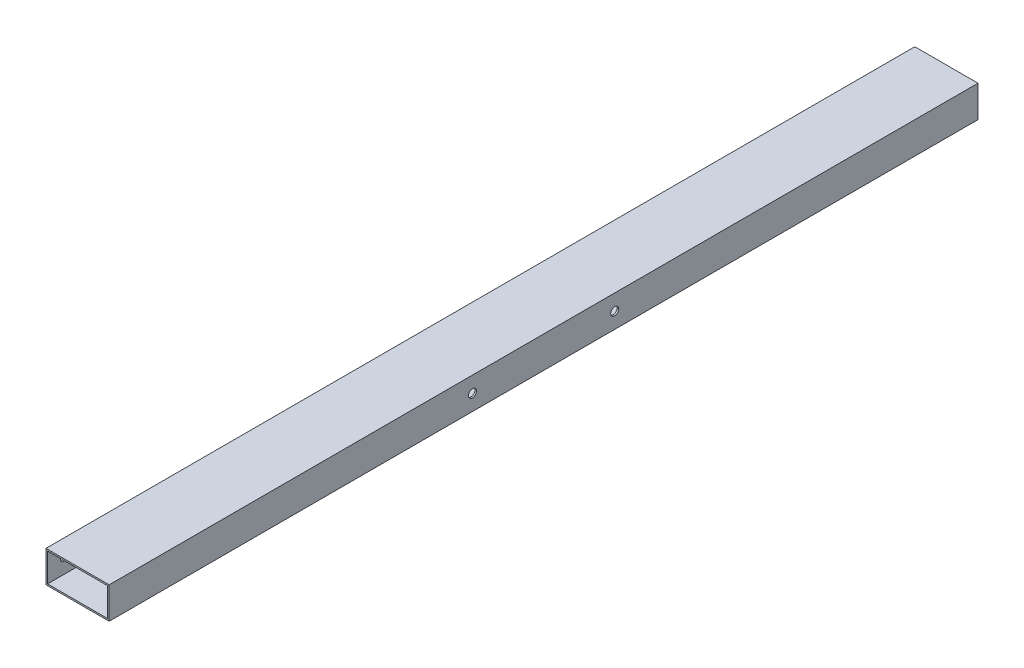
ISO-10303-21;
HEADER;
FILE_DESCRIPTION(('STEP AP214'),'2;1');
FILE_NAME('part.step','',(''),(''),'','','');
FILE_SCHEMA(('AUTOMOTIVE_DESIGN { 1 0 10303 214 1 1 1 1 }'));
ENDSEC;
DATA;
#1=APPLICATION_CONTEXT('core data for automotive mechanical design processes');
#2=APPLICATION_PROTOCOL_DEFINITION('international standard','automotive_design',2000,#1);
#3=PRODUCT_CONTEXT('',#1,'mechanical');
#4=PRODUCT('Part','Part','',(#3));
#5=PRODUCT_RELATED_PRODUCT_CATEGORY('part','',(#4));
#6=PRODUCT_DEFINITION_FORMATION('','',#4);
#7=PRODUCT_DEFINITION_CONTEXT('part definition',#1,'design');
#8=PRODUCT_DEFINITION('design','',#6,#7);
#9=PRODUCT_DEFINITION_SHAPE('','',#8);
#10=(LENGTH_UNIT() NAMED_UNIT(*) SI_UNIT(.MILLI.,.METRE.));
#11=(NAMED_UNIT(*) PLANE_ANGLE_UNIT() SI_UNIT($,.RADIAN.));
#12=(NAMED_UNIT(*) SI_UNIT($,.STERADIAN.) SOLID_ANGLE_UNIT());
#13=UNCERTAINTY_MEASURE_WITH_UNIT(LENGTH_MEASURE(1.E-05),#10,'distance_accuracy_value','');
#14=(GEOMETRIC_REPRESENTATION_CONTEXT(3) GLOBAL_UNCERTAINTY_ASSIGNED_CONTEXT((#13)) GLOBAL_UNIT_ASSIGNED_CONTEXT((#10,
#11,#12)) REPRESENTATION_CONTEXT('',''));
#15=CARTESIAN_POINT('',(0.,0.,0.));
#16=DIRECTION('',(0.,0.,1.));
#17=DIRECTION('',(1.,0.,0.));
#18=AXIS2_PLACEMENT_3D('',#15,#16,#17);
#19=CARTESIAN_POINT('',(0.,0.,550.));
#20=DIRECTION('',(0.,0.,1.));
#21=DIRECTION('',(1.,0.,0.));
#22=AXIS2_PLACEMENT_3D('',#19,#20,#21);
#23=PLANE('',#22);
#24=DIRECTION('',(0.,-1.,0.));
#25=VECTOR('',#24,1.);
#26=CARTESIAN_POINT('',(0.,0.,550.));
#27=LINE('',#26,#25);
#28=CARTESIAN_POINT('',(0.,0.,550.));
#29=VERTEX_POINT('',#28);
#30=CARTESIAN_POINT('',(0.,-20.,550.));
#31=VERTEX_POINT('',#30);
#32=EDGE_CURVE('E170',#29,#31,#27,.T.);
#33=ORIENTED_EDGE('',*,*,#32,.T.);
#34=DIRECTION('',(1.,0.,0.));
#35=VECTOR('',#34,1.);
#36=CARTESIAN_POINT('',(0.,-20.,550.));
#37=LINE('',#36,#35);
#38=CARTESIAN_POINT('',(40.,-20.,550.));
#39=VERTEX_POINT('',#38);
#40=EDGE_CURVE('E173',#31,#39,#37,.T.);
#41=ORIENTED_EDGE('',*,*,#40,.T.);
#42=DIRECTION('',(0.,1.,0.));
#43=VECTOR('',#42,1.);
#44=CARTESIAN_POINT('',(40.,0.,550.));
#45=LINE('',#44,#43);
#46=CARTESIAN_POINT('',(40.,0.,550.));
#47=VERTEX_POINT('',#46);
#48=EDGE_CURVE('E176',#39,#47,#45,.T.);
#49=ORIENTED_EDGE('',*,*,#48,.T.);
#50=DIRECTION('',(-1.,0.,0.));
#51=VECTOR('',#50,1.);
#52=CARTESIAN_POINT('',(0.,0.,550.));
#53=LINE('',#52,#51);
#54=EDGE_CURVE('E178',#47,#29,#53,.T.);
#55=ORIENTED_EDGE('',*,*,#54,.T.);
#56=EDGE_LOOP('',(#33,#41,#49,#55));
#57=FACE_BOUND('',#56,.T.);
#58=DIRECTION('',(1.,0.,0.));
#59=VECTOR('',#58,1.);
#60=CARTESIAN_POINT('',(0.,-19.,550.));
#61=LINE('',#60,#59);
#62=CARTESIAN_POINT('',(1.,-19.,550.));
#63=VERTEX_POINT('',#62);
#64=CARTESIAN_POINT('',(39.,-19.,550.));
#65=VERTEX_POINT('',#64);
#66=EDGE_CURVE('E140',#63,#65,#61,.T.);
#67=ORIENTED_EDGE('',*,*,#66,.F.);
#68=DIRECTION('',(0.,-1.,0.));
#69=VECTOR('',#68,1.);
#70=CARTESIAN_POINT('',(1.,0.,550.));
#71=LINE('',#70,#69);
#72=CARTESIAN_POINT('',(1.,-1.,550.));
#73=VERTEX_POINT('',#72);
#74=EDGE_CURVE('E132',#73,#63,#71,.T.);
#75=ORIENTED_EDGE('',*,*,#74,.F.);
#76=DIRECTION('',(-1.,0.,0.));
#77=VECTOR('',#76,1.);
#78=CARTESIAN_POINT('',(0.,-1.,550.));
#79=LINE('',#78,#77);
#80=CARTESIAN_POINT('',(39.,-1.,550.));
#81=VERTEX_POINT('',#80);
#82=EDGE_CURVE('E154',#81,#73,#79,.T.);
#83=ORIENTED_EDGE('',*,*,#82,.F.);
#84=DIRECTION('',(0.,1.,0.));
#85=VECTOR('',#84,1.);
#86=CARTESIAN_POINT('',(39.,0.,550.));
#87=LINE('',#86,#85);
#88=EDGE_CURVE('E152',#65,#81,#87,.T.);
#89=ORIENTED_EDGE('',*,*,#88,.F.);
#90=EDGE_LOOP('',(#67,#75,#83,#89));
#91=FACE_BOUND('',#90,.T.);
#92=ADVANCED_FACE('F65',(#57,#91),#23,.T.);
#93=CARTESIAN_POINT('',(0.,0.,0.));
#94=DIRECTION('',(0.,0.,1.));
#95=DIRECTION('',(1.,0.,0.));
#96=AXIS2_PLACEMENT_3D('',#93,#94,#95);
#97=PLANE('',#96);
#98=DIRECTION('',(0.,-1.,0.));
#99=VECTOR('',#98,1.);
#100=CARTESIAN_POINT('',(0.,0.,0.));
#101=LINE('',#100,#99);
#102=CARTESIAN_POINT('',(0.,0.,0.));
#103=VERTEX_POINT('',#102);
#104=CARTESIAN_POINT('',(0.,-20.,0.));
#105=VERTEX_POINT('',#104);
#106=EDGE_CURVE('E148',#103,#105,#101,.T.);
#107=ORIENTED_EDGE('',*,*,#106,.F.);
#108=DIRECTION('',(-1.,0.,0.));
#109=VECTOR('',#108,1.);
#110=CARTESIAN_POINT('',(0.,0.,0.));
#111=LINE('',#110,#109);
#112=CARTESIAN_POINT('',(40.,0.,0.));
#113=VERTEX_POINT('',#112);
#114=EDGE_CURVE('E174',#113,#103,#111,.T.);
#115=ORIENTED_EDGE('',*,*,#114,.F.);
#116=DIRECTION('',(0.,1.,0.));
#117=VECTOR('',#116,1.);
#118=CARTESIAN_POINT('',(40.,0.,0.));
#119=LINE('',#118,#117);
#120=CARTESIAN_POINT('',(40.,-20.,0.));
#121=VERTEX_POINT('',#120);
#122=EDGE_CURVE('E185',#121,#113,#119,.T.);
#123=ORIENTED_EDGE('',*,*,#122,.F.);
#124=DIRECTION('',(1.,0.,0.));
#125=VECTOR('',#124,1.);
#126=CARTESIAN_POINT('',(0.,-20.,0.));
#127=LINE('',#126,#125);
#128=EDGE_CURVE('E183',#105,#121,#127,.T.);
#129=ORIENTED_EDGE('',*,*,#128,.F.);
#130=EDGE_LOOP('',(#107,#115,#123,#129));
#131=FACE_BOUND('',#130,.T.);
#132=DIRECTION('',(0.,-1.,0.));
#133=VECTOR('',#132,1.);
#134=CARTESIAN_POINT('',(1.,0.,0.));
#135=LINE('',#134,#133);
#136=CARTESIAN_POINT('',(1.,-1.,0.));
#137=VERTEX_POINT('',#136);
#138=CARTESIAN_POINT('',(1.,-19.,0.));
#139=VERTEX_POINT('',#138);
#140=EDGE_CURVE('E90',#137,#139,#135,.T.);
#141=ORIENTED_EDGE('',*,*,#140,.T.);
#142=DIRECTION('',(1.,0.,0.));
#143=VECTOR('',#142,1.);
#144=CARTESIAN_POINT('',(0.,-19.,0.));
#145=LINE('',#144,#143);
#146=CARTESIAN_POINT('',(39.,-19.,0.));
#147=VERTEX_POINT('',#146);
#148=EDGE_CURVE('E147',#139,#147,#145,.T.);
#149=ORIENTED_EDGE('',*,*,#148,.T.);
#150=DIRECTION('',(0.,1.,0.));
#151=VECTOR('',#150,1.);
#152=CARTESIAN_POINT('',(39.,0.,0.));
#153=LINE('',#152,#151);
#154=CARTESIAN_POINT('',(39.,-1.,0.));
#155=VERTEX_POINT('',#154);
#156=EDGE_CURVE('E162',#147,#155,#153,.T.);
#157=ORIENTED_EDGE('',*,*,#156,.T.);
#158=DIRECTION('',(-1.,0.,0.));
#159=VECTOR('',#158,1.);
#160=CARTESIAN_POINT('',(0.,-1.,0.));
#161=LINE('',#160,#159);
#162=EDGE_CURVE('E141',#155,#137,#161,.T.);
#163=ORIENTED_EDGE('',*,*,#162,.T.);
#164=EDGE_LOOP('',(#141,#149,#157,#163));
#165=FACE_BOUND('',#164,.T.);
#166=ADVANCED_FACE('F241',(#131,#165),#97,.F.);
#167=CARTESIAN_POINT('',(0.,0.,550.));
#168=DIRECTION('',(1.,0.,0.));
#169=DIRECTION('',(0.,0.,-1.));
#170=AXIS2_PLACEMENT_3D('',#167,#168,#169);
#171=PLANE('',#170);
#172=CARTESIAN_POINT('',(0.,-10.,320.));
#173=DIRECTION('',(1.,0.,0.));
#174=DIRECTION('',(0.,0.,-1.));
#175=AXIS2_PLACEMENT_3D('',#172,#173,#174);
#176=CIRCLE('',#175,2.50000000000002);
#177=CARTESIAN_POINT('',(0.,-10.,317.5));
#178=VERTEX_POINT('',#177);
#179=EDGE_CURVE('E208',#178,#178,#176,.T.);
#180=ORIENTED_EDGE('',*,*,#179,.T.);
#181=EDGE_LOOP('',(#180));
#182=FACE_BOUND('',#181,.T.);
#183=CARTESIAN_POINT('',(0.,-10.,230.));
#184=DIRECTION('',(1.,0.,0.));
#185=DIRECTION('',(0.,0.,-1.));
#186=AXIS2_PLACEMENT_3D('',#183,#184,#185);
#187=CIRCLE('',#186,2.5);
#188=CARTESIAN_POINT('',(0.,-10.,227.5));
#189=VERTEX_POINT('',#188);
#190=EDGE_CURVE('E224',#189,#189,#187,.T.);
#191=ORIENTED_EDGE('',*,*,#190,.T.);
#192=EDGE_LOOP('',(#191));
#193=FACE_BOUND('',#192,.T.);
#194=CARTESIAN_POINT('',(0.,-10.,255.));
#195=DIRECTION('',(-1.,0.,0.));
#196=DIRECTION('',(0.,0.,1.));
#197=AXIS2_PLACEMENT_3D('',#194,#195,#196);
#198=CIRCLE('',#197,2.60000000000002);
#199=CARTESIAN_POINT('',(0.,-10.,257.6));
#200=VERTEX_POINT('',#199);
#201=EDGE_CURVE('E204',#200,#200,#198,.T.);
#202=ORIENTED_EDGE('',*,*,#201,.F.);
#203=EDGE_LOOP('',(#202));
#204=FACE_BOUND('',#203,.T.);
#205=CARTESIAN_POINT('',(0.,-10.,539.996387591484));
#206=DIRECTION('',(-1.,0.,0.));
#207=DIRECTION('',(0.,0.,1.));
#208=AXIS2_PLACEMENT_3D('',#205,#206,#207);
#209=CIRCLE('',#208,1.74999999999999);
#210=CARTESIAN_POINT('',(0.,-10.,541.746387591484));
#211=VERTEX_POINT('',#210);
#212=EDGE_CURVE('E198',#211,#211,#209,.T.);
#213=ORIENTED_EDGE('',*,*,#212,.F.);
#214=EDGE_LOOP('',(#213));
#215=FACE_BOUND('',#214,.T.);
#216=CARTESIAN_POINT('',(0.,-10.0000000016865,9.99999999967148));
#217=DIRECTION('',(-1.,0.,0.));
#218=DIRECTION('',(0.,0.,1.));
#219=AXIS2_PLACEMENT_3D('',#216,#217,#218);
#220=CIRCLE('',#219,1.75000000031466);
#221=CARTESIAN_POINT('',(0.,-10.0000000016865,11.7499999999861));
#222=VERTEX_POINT('',#221);
#223=EDGE_CURVE('E203',#222,#222,#220,.T.);
#224=ORIENTED_EDGE('',*,*,#223,.F.);
#225=EDGE_LOOP('',(#224));
#226=FACE_BOUND('',#225,.T.);
#227=ORIENTED_EDGE('',*,*,#106,.T.);
#228=DIRECTION('',(0.,0.,-1.));
#229=VECTOR('',#228,1.);
#230=CARTESIAN_POINT('',(0.,-20.,550.));
#231=LINE('',#230,#229);
#232=EDGE_CURVE('E12',#31,#105,#231,.T.);
#233=ORIENTED_EDGE('',*,*,#232,.F.);
#234=ORIENTED_EDGE('',*,*,#32,.F.);
#235=DIRECTION('',(0.,0.,-1.));
#236=VECTOR('',#235,1.);
#237=CARTESIAN_POINT('',(0.,0.,550.));
#238=LINE('',#237,#236);
#239=EDGE_CURVE('E180',#29,#103,#238,.T.);
#240=ORIENTED_EDGE('',*,*,#239,.T.);
#241=EDGE_LOOP('',(#227,#233,#234,#240));
#242=FACE_BOUND('',#241,.T.);
#243=ADVANCED_FACE('F67',(#182,#193,#204,#215,#226,#242),#171,.F.);
#244=CARTESIAN_POINT('',(0.,-20.,550.));
#245=DIRECTION('',(0.,1.,0.));
#246=DIRECTION('',(0.,0.,1.));
#247=AXIS2_PLACEMENT_3D('',#244,#245,#246);
#248=PLANE('',#247);
#249=ORIENTED_EDGE('',*,*,#128,.T.);
#250=DIRECTION('',(0.,0.,-1.));
#251=VECTOR('',#250,1.);
#252=CARTESIAN_POINT('',(40.,-20.,550.));
#253=LINE('',#252,#251);
#254=EDGE_CURVE('E74',#39,#121,#253,.T.);
#255=ORIENTED_EDGE('',*,*,#254,.F.);
#256=ORIENTED_EDGE('',*,*,#40,.F.);
#257=ORIENTED_EDGE('',*,*,#232,.T.);
#258=EDGE_LOOP('',(#249,#255,#256,#257));
#259=FACE_BOUND('',#258,.T.);
#260=ADVANCED_FACE('F240',(#259),#248,.F.);
#261=CARTESIAN_POINT('',(40.,0.,550.));
#262=DIRECTION('',(-1.,0.,0.));
#263=DIRECTION('',(0.,0.,1.));
#264=AXIS2_PLACEMENT_3D('',#261,#262,#263);
#265=PLANE('',#264);
#266=CARTESIAN_POINT('',(40.,-10.,320.));
#267=DIRECTION('',(1.,0.,0.));
#268=DIRECTION('',(0.,0.,-1.));
#269=AXIS2_PLACEMENT_3D('',#266,#267,#268);
#270=CIRCLE('',#269,2.50000000000002);
#271=CARTESIAN_POINT('',(40.,-10.,317.5));
#272=VERTEX_POINT('',#271);
#273=EDGE_CURVE('E214',#272,#272,#270,.T.);
#274=ORIENTED_EDGE('',*,*,#273,.F.);
#275=EDGE_LOOP('',(#274));
#276=FACE_BOUND('',#275,.T.);
#277=CARTESIAN_POINT('',(40.,-10.,230.));
#278=DIRECTION('',(1.,0.,0.));
#279=DIRECTION('',(0.,0.,-1.));
#280=AXIS2_PLACEMENT_3D('',#277,#278,#279);
#281=CIRCLE('',#280,2.5);
#282=CARTESIAN_POINT('',(40.,-10.,227.5));
#283=VERTEX_POINT('',#282);
#284=EDGE_CURVE('E219',#283,#283,#281,.T.);
#285=ORIENTED_EDGE('',*,*,#284,.F.);
#286=EDGE_LOOP('',(#285));
#287=FACE_BOUND('',#286,.T.);
#288=ORIENTED_EDGE('',*,*,#122,.T.);
#289=DIRECTION('',(0.,0.,-1.));
#290=VECTOR('',#289,1.);
#291=CARTESIAN_POINT('',(40.,0.,550.));
#292=LINE('',#291,#290);
#293=EDGE_CURVE('E190',#47,#113,#292,.T.);
#294=ORIENTED_EDGE('',*,*,#293,.F.);
#295=ORIENTED_EDGE('',*,*,#48,.F.);
#296=ORIENTED_EDGE('',*,*,#254,.T.);
#297=EDGE_LOOP('',(#288,#294,#295,#296));
#298=FACE_BOUND('',#297,.T.);
#299=ADVANCED_FACE('F259',(#276,#287,#298),#265,.F.);
#300=CARTESIAN_POINT('',(0.,0.,550.));
#301=DIRECTION('',(0.,-1.,0.));
#302=DIRECTION('',(0.,0.,-1.));
#303=AXIS2_PLACEMENT_3D('',#300,#301,#302);
#304=PLANE('',#303);
#305=ORIENTED_EDGE('',*,*,#114,.T.);
#306=ORIENTED_EDGE('',*,*,#239,.F.);
#307=ORIENTED_EDGE('',*,*,#54,.F.);
#308=ORIENTED_EDGE('',*,*,#293,.T.);
#309=EDGE_LOOP('',(#305,#306,#307,#308));
#310=FACE_BOUND('',#309,.T.);
#311=ADVANCED_FACE('F257',(#310),#304,.F.);
#312=CARTESIAN_POINT('',(1.,0.,550.));
#313=DIRECTION('',(1.,0.,0.));
#314=DIRECTION('',(0.,0.,-1.));
#315=AXIS2_PLACEMENT_3D('',#312,#313,#314);
#316=PLANE('',#315);
#317=CARTESIAN_POINT('',(1.,-10.,320.));
#318=DIRECTION('',(1.,0.,0.));
#319=DIRECTION('',(0.,0.,-1.));
#320=AXIS2_PLACEMENT_3D('',#317,#318,#319);
#321=CIRCLE('',#320,2.50000000000002);
#322=CARTESIAN_POINT('',(1.,-10.,317.5));
#323=VERTEX_POINT('',#322);
#324=EDGE_CURVE('E227',#323,#323,#321,.T.);
#325=ORIENTED_EDGE('',*,*,#324,.F.);
#326=EDGE_LOOP('',(#325));
#327=FACE_BOUND('',#326,.T.);
#328=CARTESIAN_POINT('',(1.,-10.,230.));
#329=DIRECTION('',(1.,0.,0.));
#330=DIRECTION('',(0.,0.,-1.));
#331=AXIS2_PLACEMENT_3D('',#328,#329,#330);
#332=CIRCLE('',#331,2.5);
#333=CARTESIAN_POINT('',(1.,-10.,227.5));
#334=VERTEX_POINT('',#333);
#335=EDGE_CURVE('E207',#334,#334,#332,.T.);
#336=ORIENTED_EDGE('',*,*,#335,.F.);
#337=EDGE_LOOP('',(#336));
#338=FACE_BOUND('',#337,.T.);
#339=CARTESIAN_POINT('',(1.,-10.,255.));
#340=DIRECTION('',(1.,0.,0.));
#341=DIRECTION('',(0.,0.,-1.));
#342=AXIS2_PLACEMENT_3D('',#339,#340,#341);
#343=CIRCLE('',#342,2.60000000000002);
#344=CARTESIAN_POINT('',(1.,-10.,252.4));
#345=VERTEX_POINT('',#344);
#346=EDGE_CURVE('E201',#345,#345,#343,.T.);
#347=ORIENTED_EDGE('',*,*,#346,.F.);
#348=EDGE_LOOP('',(#347));
#349=FACE_BOUND('',#348,.T.);
#350=CARTESIAN_POINT('',(1.,-10.,539.996387591484));
#351=DIRECTION('',(1.,0.,0.));
#352=DIRECTION('',(0.,0.,-1.));
#353=AXIS2_PLACEMENT_3D('',#350,#351,#352);
#354=CIRCLE('',#353,1.74999999999999);
#355=CARTESIAN_POINT('',(1.,-10.,538.246387591484));
#356=VERTEX_POINT('',#355);
#357=EDGE_CURVE('E160',#356,#356,#354,.T.);
#358=ORIENTED_EDGE('',*,*,#357,.F.);
#359=EDGE_LOOP('',(#358));
#360=FACE_BOUND('',#359,.T.);
#361=CARTESIAN_POINT('',(1.,-10.0000000016865,9.99999999967148));
#362=DIRECTION('',(1.,0.,0.));
#363=DIRECTION('',(0.,0.,-1.));
#364=AXIS2_PLACEMENT_3D('',#361,#362,#363);
#365=CIRCLE('',#364,1.75000000031466);
#366=CARTESIAN_POINT('',(1.,-10.0000000016865,8.24999999935682));
#367=VERTEX_POINT('',#366);
#368=EDGE_CURVE('E195',#367,#367,#365,.T.);
#369=ORIENTED_EDGE('',*,*,#368,.F.);
#370=EDGE_LOOP('',(#369));
#371=FACE_BOUND('',#370,.T.);
#372=ORIENTED_EDGE('',*,*,#140,.F.);
#373=DIRECTION('',(0.,0.,-1.));
#374=VECTOR('',#373,1.);
#375=CARTESIAN_POINT('',(1.,-1.,550.));
#376=LINE('',#375,#374);
#377=EDGE_CURVE('E136',#73,#137,#376,.T.);
#378=ORIENTED_EDGE('',*,*,#377,.F.);
#379=ORIENTED_EDGE('',*,*,#74,.T.);
#380=DIRECTION('',(0.,0.,-1.));
#381=VECTOR('',#380,1.);
#382=CARTESIAN_POINT('',(1.,-19.,550.));
#383=LINE('',#382,#381);
#384=EDGE_CURVE('E135',#63,#139,#383,.T.);
#385=ORIENTED_EDGE('',*,*,#384,.T.);
#386=EDGE_LOOP('',(#372,#378,#379,#385));
#387=FACE_BOUND('',#386,.T.);
#388=ADVANCED_FACE('F134',(#327,#338,#349,#360,#371,#387),#316,.T.);
#389=CARTESIAN_POINT('',(0.,-19.,550.));
#390=DIRECTION('',(0.,1.,0.));
#391=DIRECTION('',(0.,0.,1.));
#392=AXIS2_PLACEMENT_3D('',#389,#390,#391);
#393=PLANE('',#392);
#394=ORIENTED_EDGE('',*,*,#148,.F.);
#395=ORIENTED_EDGE('',*,*,#384,.F.);
#396=ORIENTED_EDGE('',*,*,#66,.T.);
#397=DIRECTION('',(0.,0.,-1.));
#398=VECTOR('',#397,1.);
#399=CARTESIAN_POINT('',(39.,-19.,550.));
#400=LINE('',#399,#398);
#401=EDGE_CURVE('E149',#65,#147,#400,.T.);
#402=ORIENTED_EDGE('',*,*,#401,.T.);
#403=EDGE_LOOP('',(#394,#395,#396,#402));
#404=FACE_BOUND('',#403,.T.);
#405=ADVANCED_FACE('F144',(#404),#393,.T.);
#406=CARTESIAN_POINT('',(39.,0.,550.));
#407=DIRECTION('',(-1.,0.,0.));
#408=DIRECTION('',(0.,0.,1.));
#409=AXIS2_PLACEMENT_3D('',#406,#407,#408);
#410=PLANE('',#409);
#411=CARTESIAN_POINT('',(39.,-10.,320.));
#412=DIRECTION('',(-1.,0.,0.));
#413=DIRECTION('',(0.,0.,1.));
#414=AXIS2_PLACEMENT_3D('',#411,#412,#413);
#415=CIRCLE('',#414,2.50000000000002);
#416=CARTESIAN_POINT('',(39.,-10.,322.5));
#417=VERTEX_POINT('',#416);
#418=EDGE_CURVE('E69',#417,#417,#415,.T.);
#419=ORIENTED_EDGE('',*,*,#418,.F.);
#420=EDGE_LOOP('',(#419));
#421=FACE_BOUND('',#420,.T.);
#422=CARTESIAN_POINT('',(39.,-10.,230.));
#423=DIRECTION('',(-1.,0.,0.));
#424=DIRECTION('',(0.,0.,1.));
#425=AXIS2_PLACEMENT_3D('',#422,#423,#424);
#426=CIRCLE('',#425,2.5);
#427=CARTESIAN_POINT('',(39.,-10.,232.5));
#428=VERTEX_POINT('',#427);
#429=EDGE_CURVE('E205',#428,#428,#426,.T.);
#430=ORIENTED_EDGE('',*,*,#429,.F.);
#431=EDGE_LOOP('',(#430));
#432=FACE_BOUND('',#431,.T.);
#433=ORIENTED_EDGE('',*,*,#156,.F.);
#434=ORIENTED_EDGE('',*,*,#401,.F.);
#435=ORIENTED_EDGE('',*,*,#88,.T.);
#436=DIRECTION('',(0.,0.,-1.));
#437=VECTOR('',#436,1.);
#438=CARTESIAN_POINT('',(39.,-1.,550.));
#439=LINE('',#438,#437);
#440=EDGE_CURVE('E82',#81,#155,#439,.T.);
#441=ORIENTED_EDGE('',*,*,#440,.T.);
#442=EDGE_LOOP('',(#433,#434,#435,#441));
#443=FACE_BOUND('',#442,.T.);
#444=ADVANCED_FACE('F282',(#421,#432,#443),#410,.T.);
#445=CARTESIAN_POINT('',(0.,-1.,550.));
#446=DIRECTION('',(0.,-1.,0.));
#447=DIRECTION('',(0.,0.,-1.));
#448=AXIS2_PLACEMENT_3D('',#445,#446,#447);
#449=PLANE('',#448);
#450=ORIENTED_EDGE('',*,*,#162,.F.);
#451=ORIENTED_EDGE('',*,*,#440,.F.);
#452=ORIENTED_EDGE('',*,*,#82,.T.);
#453=ORIENTED_EDGE('',*,*,#377,.T.);
#454=EDGE_LOOP('',(#450,#451,#452,#453));
#455=FACE_BOUND('',#454,.T.);
#456=ADVANCED_FACE('F285',(#455),#449,.T.);
#457=CARTESIAN_POINT('',(1.5,-10.0000000016865,9.99999999967148));
#458=DIRECTION('',(-1.,0.,0.));
#459=DIRECTION('',(0.,0.,1.));
#460=AXIS2_PLACEMENT_3D('',#457,#458,#459);
#461=CYLINDRICAL_SURFACE('',#460,1.75000000031466);
#462=ORIENTED_EDGE('',*,*,#368,.T.);
#463=EDGE_LOOP('',(#462));
#464=FACE_BOUND('',#463,.T.);
#465=ORIENTED_EDGE('',*,*,#223,.T.);
#466=EDGE_LOOP('',(#465));
#467=FACE_BOUND('',#466,.T.);
#468=ADVANCED_FACE('F236',(#464,#467),#461,.F.);
#469=CARTESIAN_POINT('',(1.5,-10.,539.996387591484));
#470=DIRECTION('',(-1.,0.,0.));
#471=DIRECTION('',(0.,0.,1.));
#472=AXIS2_PLACEMENT_3D('',#469,#470,#471);
#473=CYLINDRICAL_SURFACE('',#472,1.74999999999999);
#474=ORIENTED_EDGE('',*,*,#357,.T.);
#475=EDGE_LOOP('',(#474));
#476=FACE_BOUND('',#475,.T.);
#477=ORIENTED_EDGE('',*,*,#212,.T.);
#478=EDGE_LOOP('',(#477));
#479=FACE_BOUND('',#478,.T.);
#480=ADVANCED_FACE('F291',(#476,#479),#473,.F.);
#481=CARTESIAN_POINT('',(1.5,-10.,255.));
#482=DIRECTION('',(-1.,0.,0.));
#483=DIRECTION('',(0.,0.,1.));
#484=AXIS2_PLACEMENT_3D('',#481,#482,#483);
#485=CYLINDRICAL_SURFACE('',#484,2.60000000000002);
#486=ORIENTED_EDGE('',*,*,#346,.T.);
#487=EDGE_LOOP('',(#486));
#488=FACE_BOUND('',#487,.T.);
#489=ORIENTED_EDGE('',*,*,#201,.T.);
#490=EDGE_LOOP('',(#489));
#491=FACE_BOUND('',#490,.T.);
#492=ADVANCED_FACE('F295',(#488,#491),#485,.F.);
#493=CARTESIAN_POINT('',(0.,-10.,230.));
#494=DIRECTION('',(1.,0.,0.));
#495=DIRECTION('',(0.,0.,-1.));
#496=AXIS2_PLACEMENT_3D('',#493,#494,#495);
#497=CYLINDRICAL_SURFACE('',#496,2.5);
#498=ORIENTED_EDGE('',*,*,#429,.T.);
#499=EDGE_LOOP('',(#498));
#500=FACE_BOUND('',#499,.T.);
#501=ORIENTED_EDGE('',*,*,#284,.T.);
#502=EDGE_LOOP('',(#501));
#503=FACE_BOUND('',#502,.T.);
#504=ADVANCED_FACE('F299',(#500,#503),#497,.F.);
#505=CARTESIAN_POINT('',(0.,-10.,320.));
#506=DIRECTION('',(1.,0.,0.));
#507=DIRECTION('',(0.,0.,-1.));
#508=AXIS2_PLACEMENT_3D('',#505,#506,#507);
#509=CYLINDRICAL_SURFACE('',#508,2.50000000000002);
#510=ORIENTED_EDGE('',*,*,#418,.T.);
#511=EDGE_LOOP('',(#510));
#512=FACE_BOUND('',#511,.T.);
#513=ORIENTED_EDGE('',*,*,#273,.T.);
#514=EDGE_LOOP('',(#513));
#515=FACE_BOUND('',#514,.T.);
#516=ADVANCED_FACE('F303',(#512,#515),#509,.F.);
#517=ORIENTED_EDGE('',*,*,#335,.T.);
#518=EDGE_LOOP('',(#517));
#519=FACE_BOUND('',#518,.T.);
#520=ORIENTED_EDGE('',*,*,#190,.F.);
#521=EDGE_LOOP('',(#520));
#522=FACE_BOUND('',#521,.T.);
#523=ADVANCED_FACE('F304',(#519,#522),#497,.F.);
#524=ORIENTED_EDGE('',*,*,#324,.T.);
#525=EDGE_LOOP('',(#524));
#526=FACE_BOUND('',#525,.T.);
#527=ORIENTED_EDGE('',*,*,#179,.F.);
#528=EDGE_LOOP('',(#527));
#529=FACE_BOUND('',#528,.T.);
#530=ADVANCED_FACE('F307',(#526,#529),#509,.F.);
#531=CLOSED_SHELL('',(#92,#166,#243,#260,#299,#311,#388,#405,#444,#456,#468,#480,#492,#504,#516,
#523,#530));
#532=MANIFOLD_SOLID_BREP('B2',#531);
#533=ADVANCED_BREP_SHAPE_REPRESENTATION('',(#18,#532),#14);
#534=SHAPE_DEFINITION_REPRESENTATION(#9,#533);
ENDSEC;
END-ISO-10303-21;
